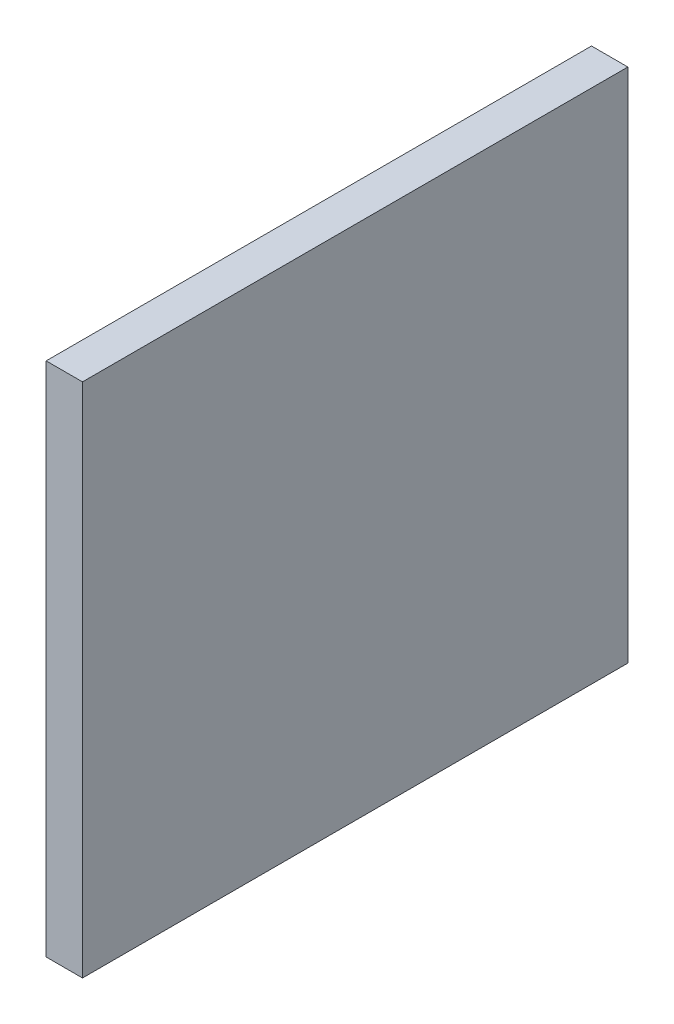
ISO-10303-21;
HEADER;
FILE_DESCRIPTION(('STEP AP214'),'2;1');
FILE_NAME('part.step','',(''),(''),'','','');
FILE_SCHEMA(('AUTOMOTIVE_DESIGN { 1 0 10303 214 1 1 1 1 }'));
ENDSEC;
DATA;
#1=APPLICATION_CONTEXT('core data for automotive mechanical design processes');
#2=APPLICATION_PROTOCOL_DEFINITION('international standard','automotive_design',2000,#1);
#3=PRODUCT_CONTEXT('',#1,'mechanical');
#4=PRODUCT('Part','Part','',(#3));
#5=PRODUCT_RELATED_PRODUCT_CATEGORY('part','',(#4));
#6=PRODUCT_DEFINITION_FORMATION('','',#4);
#7=PRODUCT_DEFINITION_CONTEXT('part definition',#1,'design');
#8=PRODUCT_DEFINITION('design','',#6,#7);
#9=PRODUCT_DEFINITION_SHAPE('','',#8);
#10=(LENGTH_UNIT() NAMED_UNIT(*) SI_UNIT(.MILLI.,.METRE.));
#11=(NAMED_UNIT(*) PLANE_ANGLE_UNIT() SI_UNIT($,.RADIAN.));
#12=(NAMED_UNIT(*) SI_UNIT($,.STERADIAN.) SOLID_ANGLE_UNIT());
#13=UNCERTAINTY_MEASURE_WITH_UNIT(LENGTH_MEASURE(1.E-05),#10,'distance_accuracy_value','');
#14=(GEOMETRIC_REPRESENTATION_CONTEXT(3) GLOBAL_UNCERTAINTY_ASSIGNED_CONTEXT((#13)) GLOBAL_UNIT_ASSIGNED_CONTEXT((#10,
#11,#12)) REPRESENTATION_CONTEXT('',''));
#15=CARTESIAN_POINT('',(0.,0.,0.));
#16=DIRECTION('',(0.,0.,1.));
#17=DIRECTION('',(1.,0.,0.));
#18=AXIS2_PLACEMENT_3D('',#15,#16,#17);
#19=CARTESIAN_POINT('',(5.,49.1740740740741,90.4592592592592));
#20=DIRECTION('',(0.,0.,-1.));
#21=DIRECTION('',(-1.,0.,0.));
#22=AXIS2_PLACEMENT_3D('',#19,#20,#21);
#23=PLANE('',#22);
#24=DIRECTION('',(0.,-1.,0.));
#25=VECTOR('',#24,1.);
#26=CARTESIAN_POINT('',(0.,49.1740740740741,90.4592592592592));
#27=LINE('',#26,#25);
#28=CARTESIAN_POINT('',(0.,49.1740740740741,90.4592592592592));
#29=VERTEX_POINT('',#28);
#30=CARTESIAN_POINT('',(0.,-21.8259259259259,90.4592592592592));
#31=VERTEX_POINT('',#30);
#32=EDGE_CURVE('E93',#29,#31,#27,.T.);
#33=ORIENTED_EDGE('',*,*,#32,.T.);
#34=DIRECTION('',(-1.,0.,0.));
#35=VECTOR('',#34,1.);
#36=CARTESIAN_POINT('',(5.,-21.8259259259259,90.4592592592592));
#37=LINE('',#36,#35);
#38=CARTESIAN_POINT('',(5.,-21.8259259259259,90.4592592592592));
#39=VERTEX_POINT('',#38);
#40=EDGE_CURVE('E11',#39,#31,#37,.T.);
#41=ORIENTED_EDGE('',*,*,#40,.F.);
#42=DIRECTION('',(0.,-1.,0.));
#43=VECTOR('',#42,1.);
#44=CARTESIAN_POINT('',(5.,49.1740740740741,90.4592592592592));
#45=LINE('',#44,#43);
#46=CARTESIAN_POINT('',(5.,49.1740740740741,90.4592592592592));
#47=VERTEX_POINT('',#46);
#48=EDGE_CURVE('E81',#47,#39,#45,.T.);
#49=ORIENTED_EDGE('',*,*,#48,.F.);
#50=DIRECTION('',(-1.,0.,0.));
#51=VECTOR('',#50,1.);
#52=CARTESIAN_POINT('',(5.,49.1740740740741,90.4592592592592));
#53=LINE('',#52,#51);
#54=EDGE_CURVE('E89',#47,#29,#53,.T.);
#55=ORIENTED_EDGE('',*,*,#54,.T.);
#56=EDGE_LOOP('',(#33,#41,#49,#55));
#57=FACE_BOUND('',#56,.T.);
#58=ADVANCED_FACE('F30',(#57),#23,.F.);
#59=CARTESIAN_POINT('',(5.,-21.8259259259259,90.4592592592592));
#60=DIRECTION('',(0.,1.,0.));
#61=DIRECTION('',(0.,0.,1.));
#62=AXIS2_PLACEMENT_3D('',#59,#60,#61);
#63=PLANE('',#62);
#64=DIRECTION('',(0.,0.,-1.));
#65=VECTOR('',#64,1.);
#66=CARTESIAN_POINT('',(0.,-21.8259259259259,90.4592592592592));
#67=LINE('',#66,#65);
#68=CARTESIAN_POINT('',(-3.33066907387547E-13,-21.8259259259259,15.4592592592593));
#69=VERTEX_POINT('',#68);
#70=EDGE_CURVE('E85',#31,#69,#67,.T.);
#71=ORIENTED_EDGE('',*,*,#70,.T.);
#72=DIRECTION('',(-1.,0.,0.));
#73=VECTOR('',#72,1.);
#74=CARTESIAN_POINT('',(4.99999999999967,-21.8259259259259,15.4592592592592));
#75=LINE('',#74,#73);
#76=CARTESIAN_POINT('',(4.99999999999967,-21.8259259259259,15.4592592592592));
#77=VERTEX_POINT('',#76);
#78=EDGE_CURVE('E38',#77,#69,#75,.T.);
#79=ORIENTED_EDGE('',*,*,#78,.F.);
#80=DIRECTION('',(0.,0.,-1.));
#81=VECTOR('',#80,1.);
#82=CARTESIAN_POINT('',(5.,-21.8259259259259,90.4592592592592));
#83=LINE('',#82,#81);
#84=EDGE_CURVE('E76',#39,#77,#83,.T.);
#85=ORIENTED_EDGE('',*,*,#84,.F.);
#86=ORIENTED_EDGE('',*,*,#40,.T.);
#87=EDGE_LOOP('',(#71,#79,#85,#86));
#88=FACE_BOUND('',#87,.T.);
#89=ADVANCED_FACE('F84',(#88),#63,.F.);
#90=CARTESIAN_POINT('',(4.99999999999967,49.1740740740741,15.4592592592592));
#91=DIRECTION('',(0.,0.,1.));
#92=DIRECTION('',(0.,-1.,0.));
#93=AXIS2_PLACEMENT_3D('',#90,#91,#92);
#94=PLANE('',#93);
#95=DIRECTION('',(0.,1.,0.));
#96=VECTOR('',#95,1.);
#97=CARTESIAN_POINT('',(-3.33066907387547E-13,49.1740740740741,15.4592592592593));
#98=LINE('',#97,#96);
#99=CARTESIAN_POINT('',(-3.33066907387547E-13,49.1740740740741,15.4592592592593));
#100=VERTEX_POINT('',#99);
#101=EDGE_CURVE('E63',#69,#100,#98,.T.);
#102=ORIENTED_EDGE('',*,*,#101,.T.);
#103=DIRECTION('',(-1.,0.,0.));
#104=VECTOR('',#103,1.);
#105=CARTESIAN_POINT('',(4.99999999999967,49.1740740740741,15.4592592592592));
#106=LINE('',#105,#104);
#107=CARTESIAN_POINT('',(4.99999999999967,49.1740740740741,15.4592592592592));
#108=VERTEX_POINT('',#107);
#109=EDGE_CURVE('E86',#108,#100,#106,.T.);
#110=ORIENTED_EDGE('',*,*,#109,.F.);
#111=DIRECTION('',(0.,1.,0.));
#112=VECTOR('',#111,1.);
#113=CARTESIAN_POINT('',(4.99999999999967,49.1740740740741,15.4592592592592));
#114=LINE('',#113,#112);
#115=EDGE_CURVE('E79',#77,#108,#114,.T.);
#116=ORIENTED_EDGE('',*,*,#115,.F.);
#117=ORIENTED_EDGE('',*,*,#78,.T.);
#118=EDGE_LOOP('',(#102,#110,#116,#117));
#119=FACE_BOUND('',#118,.T.);
#120=ADVANCED_FACE('F87',(#119),#94,.F.);
#121=CARTESIAN_POINT('',(5.,49.1740740740741,90.4592592592592));
#122=DIRECTION('',(0.,-1.,0.));
#123=DIRECTION('',(0.,0.,-1.));
#124=AXIS2_PLACEMENT_3D('',#121,#122,#123);
#125=PLANE('',#124);
#126=DIRECTION('',(0.,0.,1.));
#127=VECTOR('',#126,1.);
#128=CARTESIAN_POINT('',(0.,49.1740740740741,90.4592592592592));
#129=LINE('',#128,#127);
#130=EDGE_CURVE('E69',#100,#29,#129,.T.);
#131=ORIENTED_EDGE('',*,*,#130,.T.);
#132=ORIENTED_EDGE('',*,*,#54,.F.);
#133=DIRECTION('',(0.,0.,1.));
#134=VECTOR('',#133,1.);
#135=CARTESIAN_POINT('',(5.,49.1740740740741,90.4592592592592));
#136=LINE('',#135,#134);
#137=EDGE_CURVE('E46',#108,#47,#136,.T.);
#138=ORIENTED_EDGE('',*,*,#137,.F.);
#139=ORIENTED_EDGE('',*,*,#109,.T.);
#140=EDGE_LOOP('',(#131,#132,#138,#139));
#141=FACE_BOUND('',#140,.T.);
#142=ADVANCED_FACE('F100',(#141),#125,.F.);
#143=CARTESIAN_POINT('',(5.,0.,0.));
#144=DIRECTION('',(1.,0.,0.));
#145=DIRECTION('',(0.,0.,-1.));
#146=AXIS2_PLACEMENT_3D('',#143,#144,#145);
#147=PLANE('',#146);
#148=ORIENTED_EDGE('',*,*,#48,.T.);
#149=ORIENTED_EDGE('',*,*,#84,.T.);
#150=ORIENTED_EDGE('',*,*,#115,.T.);
#151=ORIENTED_EDGE('',*,*,#137,.T.);
#152=EDGE_LOOP('',(#148,#149,#150,#151));
#153=FACE_BOUND('',#152,.T.);
#154=ADVANCED_FACE('F77',(#153),#147,.T.);
#155=CARTESIAN_POINT('',(0.,0.,0.));
#156=DIRECTION('',(1.,0.,0.));
#157=DIRECTION('',(0.,0.,-1.));
#158=AXIS2_PLACEMENT_3D('',#155,#156,#157);
#159=PLANE('',#158);
#160=ORIENTED_EDGE('',*,*,#32,.F.);
#161=ORIENTED_EDGE('',*,*,#130,.F.);
#162=ORIENTED_EDGE('',*,*,#101,.F.);
#163=ORIENTED_EDGE('',*,*,#70,.F.);
#164=EDGE_LOOP('',(#160,#161,#162,#163));
#165=FACE_BOUND('',#164,.T.);
#166=ADVANCED_FACE('F103',(#165),#159,.F.);
#167=CLOSED_SHELL('',(#58,#89,#120,#142,#154,#166));
#168=MANIFOLD_SOLID_BREP('B2',#167);
#169=ADVANCED_BREP_SHAPE_REPRESENTATION('',(#18,#168),#14);
#170=SHAPE_DEFINITION_REPRESENTATION(#9,#169);
ENDSEC;
END-ISO-10303-21;
